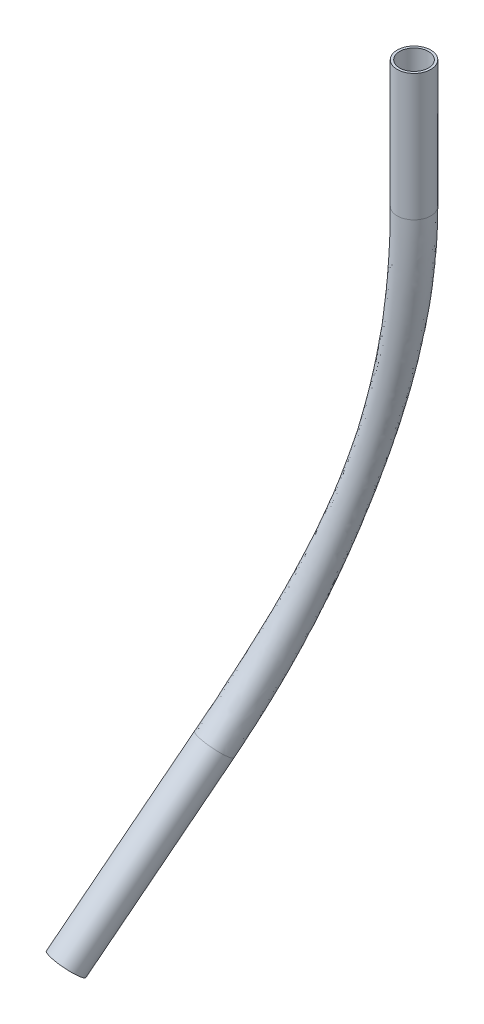
ISO-10303-21;
HEADER;
FILE_DESCRIPTION(('STEP AP214'),'2;1');
FILE_NAME('part.step','',(''),(''),'','','');
FILE_SCHEMA(('AUTOMOTIVE_DESIGN { 1 0 10303 214 1 1 1 1 }'));
ENDSEC;
DATA;
#1=APPLICATION_CONTEXT('core data for automotive mechanical design processes');
#2=APPLICATION_PROTOCOL_DEFINITION('international standard','automotive_design',2000,#1);
#3=PRODUCT_CONTEXT('',#1,'mechanical');
#4=PRODUCT('Part','Part','',(#3));
#5=PRODUCT_RELATED_PRODUCT_CATEGORY('part','',(#4));
#6=PRODUCT_DEFINITION_FORMATION('','',#4);
#7=PRODUCT_DEFINITION_CONTEXT('part definition',#1,'design');
#8=PRODUCT_DEFINITION('design','',#6,#7);
#9=PRODUCT_DEFINITION_SHAPE('','',#8);
#10=(LENGTH_UNIT() NAMED_UNIT(*) SI_UNIT(.MILLI.,.METRE.));
#11=(NAMED_UNIT(*) PLANE_ANGLE_UNIT() SI_UNIT($,.RADIAN.));
#12=(NAMED_UNIT(*) SI_UNIT($,.STERADIAN.) SOLID_ANGLE_UNIT());
#13=UNCERTAINTY_MEASURE_WITH_UNIT(LENGTH_MEASURE(1.E-05),#10,'distance_accuracy_value','');
#14=(GEOMETRIC_REPRESENTATION_CONTEXT(3) GLOBAL_UNCERTAINTY_ASSIGNED_CONTEXT((#13)) GLOBAL_UNIT_ASSIGNED_CONTEXT((#10,
#11,#12)) REPRESENTATION_CONTEXT('',''));
#15=CARTESIAN_POINT('',(0.,0.,0.));
#16=DIRECTION('',(0.,0.,1.));
#17=DIRECTION('',(1.,0.,0.));
#18=AXIS2_PLACEMENT_3D('',#15,#16,#17);
#19=CARTESIAN_POINT('',(-25.0499398331026,28.6977068396148,-25.9548102071857));
#20=DIRECTION('',(0.154747082057597,0.766044443118977,-0.623882402189063));
#21=DIRECTION('',(0.,-0.63148924671694,-0.775384634411124));
#22=AXIS2_PLACEMENT_3D('',#19,#20,#21);
#23=CYLINDRICAL_SURFACE('',#22,0.53213);
#24=CARTESIAN_POINT('',(-24.8170314040896,29.8506733797826,-26.8938099495436));
#25=DIRECTION('',(-0.154747082057597,-0.766044443118977,0.623882402189063));
#26=DIRECTION('',(0.,-0.63148924671694,-0.775384634411123));
#27=AXIS2_PLACEMENT_3D('',#24,#25,#26);
#28=CIRCLE('',#27,0.53213);
#29=CARTESIAN_POINT('',(-24.8170314040896,29.5146390069271,-27.3064153750528));
#30=VERTEX_POINT('',#29);
#31=EDGE_CURVE('E42',#30,#30,#28,.F.);
#32=ORIENTED_EDGE('',*,*,#31,.T.);
#33=EDGE_LOOP('',(#32));
#34=FACE_BOUND('',#33,.T.);
#35=CARTESIAN_POINT('',(-23.3734194889443,34.4514862154564,-30.5037501466175));
#36=CARTESIAN_POINT('',(-23.3716185247215,34.4456207717933,-30.5105054206104));
#37=CARTESIAN_POINT('',(-23.3700411802738,34.4397532343263,-30.5173187319104));
#38=CARTESIAN_POINT('',(-23.3673547745922,34.4280910185778,-30.530972045577));
#39=CARTESIAN_POINT('',(-23.3662409633807,34.4222962229716,-30.5378110138236));
#40=CARTESIAN_POINT('',(-23.3644728982267,34.4107868465445,-30.5515044453138));
#41=CARTESIAN_POINT('',(-23.3638144257776,34.4050720235419,-30.5583581595705));
#42=CARTESIAN_POINT('',(-23.3629477615519,34.3937300001551,-30.5720696862928));
#43=CARTESIAN_POINT('',(-23.3627358632804,34.3881024664429,-30.5789269886857));
#44=CARTESIAN_POINT('',(-23.3627532504102,34.3769423712058,-30.5926344109798));
#45=CARTESIAN_POINT('',(-23.3629793091582,34.3714094157779,-30.5994842142059));
#46=CARTESIAN_POINT('',(-23.3638635073627,34.3604458032342,-30.6131653847723));
#47=CARTESIAN_POINT('',(-23.3645188656099,34.3550147175604,-30.6199965884767));
#48=CARTESIAN_POINT('',(-23.3662526076751,34.3442621438102,-30.6336293514243));
#49=CARTESIAN_POINT('',(-23.3673286187526,34.338940214213,-30.6404308642642));
#50=CARTESIAN_POINT('',(-23.3698946475267,34.3284132315997,-30.6539930708104));
#51=CARTESIAN_POINT('',(-23.3713826634028,34.323207741778,-30.6607538043264));
#52=CARTESIAN_POINT('',(-23.3747637227446,34.3129209009006,-30.6742233080811));
#53=CARTESIAN_POINT('',(-23.3766550983899,34.3078391318664,-30.6809321778575));
#54=CARTESIAN_POINT('',(-23.3808339361621,34.2978069816754,-30.6942868354479));
#55=CARTESIAN_POINT('',(-23.3831200292751,34.2928562124373,-30.7009327602056));
#56=CARTESIAN_POINT('',(-23.3880793969736,34.2830933008412,-30.7141504304398));
#57=CARTESIAN_POINT('',(-23.3907515687034,34.2782808089134,-30.7207223315904));
#58=CARTESIAN_POINT('',(-23.3964742218288,34.2688016832298,-30.733780874995));
#59=CARTESIAN_POINT('',(-23.3995238370125,34.2641347451832,-30.7402676760232));
#60=CARTESIAN_POINT('',(-23.405992535107,34.2549539525993,-30.7531449542875));
#61=CARTESIAN_POINT('',(-23.4094109624411,34.2504398445776,-30.7595355801601));
#62=CARTESIAN_POINT('',(-23.4166084690968,34.2415719325669,-30.7722094556263));
#63=CARTESIAN_POINT('',(-23.4203870811546,34.2372179307733,-30.7784928321981));
#64=CARTESIAN_POINT('',(-23.4282961639297,34.2286774474802,-30.7909411673687));
#65=CARTESIAN_POINT('',(-23.4324263370742,34.2244908286285,-30.7971062208079));
#66=CARTESIAN_POINT('',(-23.4410297673477,34.2162923232159,-30.809306877882));
#67=CARTESIAN_POINT('',(-23.4455028815486,34.2122803649427,-30.8153425341184));
#68=CARTESIAN_POINT('',(-23.4547834343178,34.2044383879083,-30.8272733745541));
#69=CARTESIAN_POINT('',(-23.4595908728861,34.2006083691471,-30.8331685587535));
#70=CARTESIAN_POINT('',(-23.4695313265127,34.1931374726083,-30.8448074428545));
#71=CARTESIAN_POINT('',(-23.4746644757611,34.1894966739263,-30.8505510789215));
#72=CARTESIAN_POINT('',(-23.485247611667,34.1824114118769,-30.8618758654464));
#73=CARTESIAN_POINT('',(-23.4906978604992,34.1789671157724,-30.8674568755572));
#74=CARTESIAN_POINT('',(-23.5019064628108,34.1722820443128,-30.878445421349));
#75=CARTESIAN_POINT('',(-23.5076652022398,34.1690415354722,-30.8838527255163));
#76=CARTESIAN_POINT('',(-23.5194820573782,34.1627712130116,-30.8944828851521));
#77=CARTESIAN_POINT('',(-23.5255406799722,34.1597417785194,-30.8997054008295));
#78=CARTESIAN_POINT('',(-23.5379485761823,34.1539007659479,-30.9099550262927));
#79=CARTESIAN_POINT('',(-23.5442984754354,34.1510896954429,-30.9149816680273));
#80=CARTESIAN_POINT('',(-23.5572802022517,34.145692556268,-30.9248286084075));
#81=CARTESIAN_POINT('',(-23.5639127718781,34.143107142034,-30.9296482875533));
#82=CARTESIAN_POINT('',(-23.5774511195216,34.1381684424741,-30.9390703887815));
#83=CARTESIAN_POINT('',(-23.5843577526753,34.1358159794506,-30.9436720132929));
#84=CARTESIAN_POINT('',(-23.5984355113861,34.1313502884765,-30.952647117925));
#85=CARTESIAN_POINT('',(-23.6056075998201,34.1292380741745,-30.9570195922513));
#86=CARTESIAN_POINT('',(-23.6202075591158,34.1252599634878,-30.9655255393115));
#87=CARTESIAN_POINT('',(-23.6276364922777,34.1233952977945,-30.9696577644122));
#88=CARTESIAN_POINT('',(-23.6427414402014,34.1199193417303,-30.9776723893251));
#89=CARTESIAN_POINT('',(-23.6504186043644,34.1183095265885,-30.9815532628488));
#90=CARTESIAN_POINT('',(-23.6660113265474,34.1153503019358,-30.9890543974278));
#91=CARTESIAN_POINT('',(-23.6739281037479,34.1140026408894,-30.9926728140059));
#92=CARTESIAN_POINT('',(-23.6899913830416,34.1115747266122,-30.9996382867042));
#93=CARTESIAN_POINT('',(-23.6981391508745,34.1104965242061,-31.0029831386376));
#94=CARTESIAN_POINT('',(-23.7146557648421,34.108614501091,-31.0093907743588));
#95=CARTESIAN_POINT('',(-23.7230258933882,34.1078130621702,-31.0124509517161));
#96=CARTESIAN_POINT('',(-23.7399786200603,34.1064915122981,-31.0182785738905));
#97=CARTESIAN_POINT('',(-23.7485624803014,34.1059741410806,-31.0210429677333));
#98=CARTESIAN_POINT('',(-23.7659340730657,34.1052276475272,-31.0262683924576));
#99=CARTESIAN_POINT('',(-23.7747230027509,34.1050016470289,-31.0287258870811));
#100=CARTESIAN_POINT('',(-23.7923917487726,34.104845714864,-31.0332998866824));
#101=CARTESIAN_POINT('',(-23.8012715651091,34.1049157831974,-31.0354163916602));
#102=CARTESIAN_POINT('',(-23.8190063628096,34.1053524519644,-31.0392791396784));
#103=CARTESIAN_POINT('',(-23.8278606233734,34.105715926356,-31.0410290422951));
#104=CARTESIAN_POINT('',(-23.8455309239053,34.1067319172723,-31.0441644621175));
#105=CARTESIAN_POINT('',(-23.8543465416364,34.1073816866508,-31.0455532477214));
#106=CARTESIAN_POINT('',(-23.8719262624038,34.1089627990345,-31.0479723063956));
#107=CARTESIAN_POINT('',(-23.8806901825589,34.1098917505478,-31.0490054705375));
#108=CARTESIAN_POINT('',(-23.8981532660847,34.1120237842725,-31.050719140659));
#109=CARTESIAN_POINT('',(-23.9068524326406,34.1132248044607,-31.0514021793185));
#110=CARTESIAN_POINT('',(-23.9241728217753,34.1158935606957,-31.0524214319735));
#111=CARTESIAN_POINT('',(-23.9327941863661,34.1173595362651,-31.0527598428252));
#112=CARTESIAN_POINT('',(-23.9499458303359,34.1205508178991,-31.0530956485698));
#113=CARTESIAN_POINT('',(-23.9584763496261,34.1222746364736,-31.0530949294098));
#114=CARTESIAN_POINT('',(-23.9754332017538,34.1259742485099,-31.05275825722));
#115=CARTESIAN_POINT('',(-23.9838598376021,34.1279487992311,-31.0524239052687));
#116=CARTESIAN_POINT('',(-24.0005958551116,34.132142549071,-31.0514257221438));
#117=CARTESIAN_POINT('',(-24.0089055737925,34.1343607230691,-31.0507632332756));
#118=CARTESIAN_POINT('',(-24.0253947169873,34.1390344207073,-31.049114503794));
#119=CARTESIAN_POINT('',(-24.0335744885231,34.1414891114353,-31.0481293719605));
#120=CARTESIAN_POINT('',(-24.0497907200965,34.1466285695697,-31.0458410579746));
#121=CARTESIAN_POINT('',(-24.057827517478,34.1493126730138,-31.0445387747536));
#122=CARTESIAN_POINT('',(-24.0737448017902,34.1549037070801,-31.0416218351672));
#123=CARTESIAN_POINT('',(-24.0816256001909,34.1578101218578,-31.0400078894468));
#124=CARTESIAN_POINT('',(-24.097217902579,34.1638385500003,-31.0364732800806));
#125=CARTESIAN_POINT('',(-24.1049296785731,34.1669601773635,-31.0345531578616));
#126=CARTESIAN_POINT('',(-24.1201709646944,34.1734118203524,-31.0304118313912));
#127=CARTESIAN_POINT('',(-24.1277006954993,34.1767415641099,-31.0281910156945));
#128=CARTESIAN_POINT('',(-24.1425649307157,34.1836022452149,-31.0234539216534));
#129=CARTESIAN_POINT('',(-24.1498995934705,34.1871330115882,-31.020937892518));
#130=CARTESIAN_POINT('',(-24.1643607422758,34.1943885564157,-31.015615977355));
#131=CARTESIAN_POINT('',(-24.1714873133612,34.1981132538395,-31.0128102119141));
#132=CARTESIAN_POINT('',(-24.1855193388488,34.2057494901387,-31.0069144190998));
#133=CARTESIAN_POINT('',(-24.192424793251,34.2096610290141,-31.0038243917264));
#134=CARTESIAN_POINT('',(-24.2060016566199,34.2176637864546,-30.9973656619035));
#135=CARTESIAN_POINT('',(-24.21267296734,34.2217550788602,-30.9939968444184));
#136=CARTESIAN_POINT('',(-24.2257686274344,34.2301101887815,-30.9869861155947));
#137=CARTESIAN_POINT('',(-24.2321927649443,34.2343741481451,-30.9833439775351));
#138=CARTESIAN_POINT('',(-24.244781177827,34.2430674432778,-30.9757921853209));
#139=CARTESIAN_POINT('',(-24.2509451095765,34.247496984008,-30.9718821942694));
#140=CARTESIAN_POINT('',(-24.2630002281341,34.2565142981635,-30.9638002721598));
#141=CARTESIAN_POINT('',(-24.2688909181162,34.2611023352435,-30.9596278941367));
#142=CARTESIAN_POINT('',(-24.2803866917007,34.2704295029698,-30.9510267738458));
#143=CARTESIAN_POINT('',(-24.2859911000884,34.2751689515104,-30.9465974737667));
#144=CARTESIAN_POINT('',(-24.2969014742017,34.2847918077122,-30.9374880856158));
#145=CARTESIAN_POINT('',(-24.302206557072,34.2896755824676,-30.9328073278185));
#146=CARTESIAN_POINT('',(-24.3125054731054,34.299579961989,-30.9232006011833));
#147=CARTESIAN_POINT('',(-24.3174981822739,34.3046009768379,-30.9182738500237));
#148=CARTESIAN_POINT('',(-24.327159577316,34.3147727140128,-30.9081807138394));
#149=CARTESIAN_POINT('',(-24.3318268603091,34.3199238814171,-30.9030134343488));
#150=CARTESIAN_POINT('',(-24.3408246670394,34.330348809582,-30.8924448176815));
#151=CARTESIAN_POINT('',(-24.3451534672276,34.3356230400255,-30.8870424762896));
#152=CARTESIAN_POINT('',(-24.353461613925,34.3462869910402,-30.8760093089273));
#153=CARTESIAN_POINT('',(-24.35743887086,34.3516771925138,-30.8703773741771));
#154=CARTESIAN_POINT('',(-24.3650312815062,34.3625659961742,-30.8588905873759));
#155=CARTESIAN_POINT('',(-24.3686439314298,34.3680650735588,-30.8530345308086));
#156=CARTESIAN_POINT('',(-24.3754945260756,34.3791645574068,-30.8411050576173));
#157=CARTESIAN_POINT('',(-24.3787295028193,34.3847654124514,-30.8350303540213));
#158=CARTESIAN_POINT('',(-24.3848121976592,34.3960614001804,-30.8226691312577));
#159=CARTESIAN_POINT('',(-24.3876564331578,34.401756929601,-30.8163812611312));
#160=CARTESIAN_POINT('',(-24.39294514245,34.4132352449676,-30.8035992250548));
#161=CARTESIAN_POINT('',(-24.3953855697898,34.4190183461957,-30.7971036683029));
#162=CARTESIAN_POINT('',(-24.3998542015541,34.430664796448,-30.7839117738968));
#163=CARTESIAN_POINT('',(-24.4018777493882,34.4365283451348,-30.7772140360681));
#164=CARTESIAN_POINT('',(-24.4054789196991,34.4482593779381,-30.7637031214088));
#165=CARTESIAN_POINT('',(-24.4070565421761,34.4541268620546,-30.7568899445782));
#166=CARTESIAN_POINT('',(-24.4097431488713,34.4657890392309,-30.7432367281324));
#167=CARTESIAN_POINT('',(-24.4108568867702,34.4715838489049,-30.7363977244281));
#168=CARTESIAN_POINT('',(-24.4126248988486,34.4830932355166,-30.7227042672677));
#169=CARTESIAN_POINT('',(-24.4132833906624,34.4888080548033,-30.7158505623767));
#170=CARTESIAN_POINT('',(-24.4141500689252,34.5001500754966,-30.7021390424435));
#171=CARTESIAN_POINT('',(-24.4143619620734,34.5057776101918,-30.6952817375727));
#172=CARTESIAN_POINT('',(-24.4143445712256,34.5169377061424,-30.6815743134804));
#173=CARTESIAN_POINT('',(-24.414118513835,34.5224706613099,-30.6747245109108));
#174=CARTESIAN_POINT('',(-24.4132343166168,34.5334342736643,-30.6610433408215));
#175=CARTESIAN_POINT('',(-24.4125789580094,34.5388653594072,-30.6542121369428));
#176=CARTESIAN_POINT('',(-24.4108452156822,34.5496179332077,-30.6405793738685));
#177=CARTESIAN_POINT('',(-24.4097692047005,34.5549398627865,-30.6337778610749));
#178=CARTESIAN_POINT('',(-24.4072031759959,34.5654668453865,-30.6202156545624));
#179=CARTESIAN_POINT('',(-24.4057151600944,34.570672335213,-30.6134549210341));
#180=CARTESIAN_POINT('',(-24.4023341007341,34.580959176094,-30.5999854172704));
#181=CARTESIAN_POINT('',(-24.4004427250955,34.5860409451269,-30.5932765474973));
#182=CARTESIAN_POINT('',(-24.3962638873283,34.5960730953169,-30.5799218899092));
#183=CARTESIAN_POINT('',(-24.3939777942135,34.6010238645554,-30.5732759651507));
#184=CARTESIAN_POINT('',(-24.3890184265136,34.6107867761517,-30.5600582949159));
#185=CARTESIAN_POINT('',(-24.3863462547844,34.6155992680795,-30.5534863937655));
#186=CARTESIAN_POINT('',(-24.3806236016594,34.625078393763,-30.5404278503611));
#187=CARTESIAN_POINT('',(-24.3775739864755,34.6297453318096,-30.5339410493328));
#188=CARTESIAN_POINT('',(-24.3711052883809,34.6389261243935,-30.5210637710685));
#189=CARTESIAN_POINT('',(-24.3676868610468,34.6434402324153,-30.5146731451959));
#190=CARTESIAN_POINT('',(-24.3604893543911,34.6523081444259,-30.5019992697297));
#191=CARTESIAN_POINT('',(-24.3567107423333,34.6566621462195,-30.4957158931579));
#192=CARTESIAN_POINT('',(-24.3488016595582,34.6652026295127,-30.4832675579873));
#193=CARTESIAN_POINT('',(-24.3446714864137,34.6693892483643,-30.4771025045481));
#194=CARTESIAN_POINT('',(-24.3360680561402,34.6775877537769,-30.4649018474739));
#195=CARTESIAN_POINT('',(-24.3315949419394,34.6815997120502,-30.4588661912376));
#196=CARTESIAN_POINT('',(-24.3223143891702,34.6894416890845,-30.4469353508019));
#197=CARTESIAN_POINT('',(-24.3175069506018,34.6932717078457,-30.4410401666025));
#198=CARTESIAN_POINT('',(-24.3075664969753,34.7007426043845,-30.4294012825015));
#199=CARTESIAN_POINT('',(-24.3024333477268,34.7043834030665,-30.4236576464344));
#200=CARTESIAN_POINT('',(-24.291850211821,34.7114686651159,-30.4123328599095));
#201=CARTESIAN_POINT('',(-24.2863999629888,34.7149129612204,-30.4067518497987));
#202=CARTESIAN_POINT('',(-24.2751913606771,34.72159803268,-30.395763304007));
#203=CARTESIAN_POINT('',(-24.2694326212482,34.7248385415207,-30.3903559998397));
#204=CARTESIAN_POINT('',(-24.2576157661098,34.7311088639812,-30.3797258402039));
#205=CARTESIAN_POINT('',(-24.2515571435157,34.7341382984735,-30.3745033245265));
#206=CARTESIAN_POINT('',(-24.2391492473056,34.739979311045,-30.3642536990632));
#207=CARTESIAN_POINT('',(-24.2327993480525,34.7427903815499,-30.3592270573287));
#208=CARTESIAN_POINT('',(-24.2198176212363,34.7481875207249,-30.3493801169485));
#209=CARTESIAN_POINT('',(-24.2131850516099,34.7507729349588,-30.3445604378026));
#210=CARTESIAN_POINT('',(-24.1996467039664,34.7557116345188,-30.3351383365745));
#211=CARTESIAN_POINT('',(-24.1927400708126,34.7580640975422,-30.3305367120631));
#212=CARTESIAN_POINT('',(-24.1786623121019,34.7625297885163,-30.321561607431));
#213=CARTESIAN_POINT('',(-24.1714902236678,34.7646420028184,-30.3171891331047));
#214=CARTESIAN_POINT('',(-24.1568902643722,34.7686201135051,-30.3086831860445));
#215=CARTESIAN_POINT('',(-24.1494613312102,34.7704847791984,-30.3045509609438));
#216=CARTESIAN_POINT('',(-24.1343563832865,34.7739607352625,-30.2965363360309));
#217=CARTESIAN_POINT('',(-24.1266792191235,34.7755705504043,-30.2926554625072));
#218=CARTESIAN_POINT('',(-24.1110864969405,34.778529775057,-30.2851543279282));
#219=CARTESIAN_POINT('',(-24.1031697197401,34.7798774361034,-30.2815359113501));
#220=CARTESIAN_POINT('',(-24.0871064404464,34.7823053503806,-30.2745704386518));
#221=CARTESIAN_POINT('',(-24.0789586726135,34.7833835527867,-30.2712255867184));
#222=CARTESIAN_POINT('',(-24.0624420586458,34.7852655759018,-30.2648179509972));
#223=CARTESIAN_POINT('',(-24.0540719300997,34.7860670148227,-30.2617577736399));
#224=CARTESIAN_POINT('',(-24.0371192034276,34.7873885646948,-30.2559301514654));
#225=CARTESIAN_POINT('',(-24.0285353431865,34.7879059359122,-30.2531657576227));
#226=CARTESIAN_POINT('',(-24.0111637504222,34.7886524294657,-30.2479403328984));
#227=CARTESIAN_POINT('',(-24.002374820737,34.788878429964,-30.2454828382749));
#228=CARTESIAN_POINT('',(-23.9847060747153,34.7890343621288,-30.2409088386736));
#229=CARTESIAN_POINT('',(-23.9758262583788,34.7889642937954,-30.2387923336958));
#230=CARTESIAN_POINT('',(-23.9580914606783,34.7885276250285,-30.2349295856776));
#231=CARTESIAN_POINT('',(-23.9492372001145,34.7881641506368,-30.2331796830609));
#232=CARTESIAN_POINT('',(-23.9315668995826,34.7871481597205,-30.2300442632384));
#233=CARTESIAN_POINT('',(-23.9227512818515,34.786498390342,-30.2286554776345));
#234=CARTESIAN_POINT('',(-23.9051715610841,34.7849172779583,-30.2262364189604));
#235=CARTESIAN_POINT('',(-23.896407640929,34.7839883264451,-30.2252032548184));
#236=CARTESIAN_POINT('',(-23.8789445574033,34.7818562927203,-30.223489584697));
#237=CARTESIAN_POINT('',(-23.8702453908473,34.7806552725321,-30.2228065460375));
#238=CARTESIAN_POINT('',(-23.8529250017127,34.7779865162971,-30.2217872933825));
#239=CARTESIAN_POINT('',(-23.8443036371218,34.7765205407277,-30.2214488825308));
#240=CARTESIAN_POINT('',(-23.827151993152,34.7733292590937,-30.2211130767861));
#241=CARTESIAN_POINT('',(-23.8186214738618,34.7716054405193,-30.2211137959462));
#242=CARTESIAN_POINT('',(-23.8016646217342,34.7679058284829,-30.221450468136));
#243=CARTESIAN_POINT('',(-23.7932379858859,34.7659312777617,-30.2217848200873));
#244=CARTESIAN_POINT('',(-23.7765019683763,34.7617375279219,-30.2227830032122));
#245=CARTESIAN_POINT('',(-23.7681922496954,34.7595193539237,-30.2234454920804));
#246=CARTESIAN_POINT('',(-23.7517031065007,34.7548456562856,-30.225094221562));
#247=CARTESIAN_POINT('',(-23.7435233349648,34.7523909655575,-30.2260793533955));
#248=CARTESIAN_POINT('',(-23.7273071033914,34.7472515074231,-30.2283676673814));
#249=CARTESIAN_POINT('',(-23.71927030601,34.744567403979,-30.2296699506024));
#250=CARTESIAN_POINT('',(-23.7033530216978,34.7389763699127,-30.2325868901888));
#251=CARTESIAN_POINT('',(-23.6954722232971,34.736069955135,-30.2342008359092));
#252=CARTESIAN_POINT('',(-23.6798799209089,34.7300415269925,-30.2377354452754));
#253=CARTESIAN_POINT('',(-23.6721681449148,34.7269198996293,-30.2396555674944));
#254=CARTESIAN_POINT('',(-23.6569268587936,34.7204682566404,-30.2437968939647));
#255=CARTESIAN_POINT('',(-23.6493971279886,34.7171385128829,-30.2460177096615));
#256=CARTESIAN_POINT('',(-23.6345328927723,34.710277831778,-30.2507548037025));
#257=CARTESIAN_POINT('',(-23.6271982300174,34.7067470654046,-30.253270832838));
#258=CARTESIAN_POINT('',(-23.6127370812122,34.6994915205772,-30.258592748001));
#259=CARTESIAN_POINT('',(-23.6056105101268,34.6957668231534,-30.2613985134419));
#260=CARTESIAN_POINT('',(-23.5915784846391,34.6881305868541,-30.2672943062562));
#261=CARTESIAN_POINT('',(-23.5846730302369,34.6842190479787,-30.2703843336295));
#262=CARTESIAN_POINT('',(-23.5710961668681,34.6762162905383,-30.2768430634525));
#263=CARTESIAN_POINT('',(-23.564424856148,34.6721249981326,-30.2802118809376));
#264=CARTESIAN_POINT('',(-23.5513291960535,34.6637698882113,-30.2872226097613));
#265=CARTESIAN_POINT('',(-23.5449050585437,34.6595059288478,-30.2908647478209));
#266=CARTESIAN_POINT('',(-23.5323166456609,34.6508126337151,-30.2984165400351));
#267=CARTESIAN_POINT('',(-23.5261527139114,34.6463830929848,-30.3023265310866));
#268=CARTESIAN_POINT('',(-23.5140975953539,34.6373657788293,-30.3104084531962));
#269=CARTESIAN_POINT('',(-23.5082069053719,34.6327777417494,-30.3145808312193));
#270=CARTESIAN_POINT('',(-23.4967111317871,34.623450574023,-30.3231819515102));
#271=CARTESIAN_POINT('',(-23.4911067233989,34.6187111254823,-30.3276112515892));
#272=CARTESIAN_POINT('',(-23.4801963492869,34.6090882692808,-30.3367206397402));
#273=CARTESIAN_POINT('',(-23.4748912664187,34.6042044945256,-30.3414013975376));
#274=CARTESIAN_POINT('',(-23.4645923503798,34.5943001150034,-30.3510081241725));
#275=CARTESIAN_POINT('',(-23.4595996412038,34.5892791001533,-30.3559348753317));
#276=CARTESIAN_POINT('',(-23.4499382461822,34.5791073629817,-30.3660280115172));
#277=CARTESIAN_POINT('',(-23.4452709632175,34.5739561955818,-30.3711952910093));
#278=CARTESIAN_POINT('',(-23.4362731564097,34.5635312674048,-30.3817639076723));
#279=CARTESIAN_POINT('',(-23.4319443561151,34.5582570369447,-30.3871662490582));
#280=CARTESIAN_POINT('',(-23.423636209709,34.5475930859754,-30.398199416437));
#281=CARTESIAN_POINT('',(-23.4196589531746,34.5422028845642,-30.4038313512099));
#282=CARTESIAN_POINT('',(-23.4120665414316,34.5313140807329,-30.4153181379488));
#283=CARTESIAN_POINT('',(-23.4084538899984,34.5258150031132,-30.4211741944304));
#284=CARTESIAN_POINT('',(-23.4016032994874,34.5147155199093,-30.4331036678564));
#285=CARTESIAN_POINT('',(-23.3983683284412,34.5091146657522,-30.4391783717758));
#286=CARTESIAN_POINT('',(-23.3922856179909,34.4978186755914,-30.4515395936535));
#287=CARTESIAN_POINT('',(-23.389441360957,34.4921231428159,-30.4578274625578));
#288=CARTESIAN_POINT('',(-23.3841527106896,34.4806448366445,-30.470609501984));
#289=CARTESIAN_POINT('',(-23.38171236488,34.4748617481177,-30.4771050633631));
#290=CARTESIAN_POINT('',(-23.3772435095704,34.4632152630402,-30.4902969450821));
#291=CARTESIAN_POINT('',(-23.3752196525431,34.4573516661852,-30.4969946653629));
#292=CARTESIAN_POINT('',(-23.3734194889443,34.4514862154564,-30.5037501466175));
#293=B_SPLINE_CURVE_WITH_KNOTS('',3,(#35,#36,#37,#38,#39,#40,#41,#42,#43,#44,#45,#46,#47,#48,
#49,#50,#51,#52,#53,#54,#55,#56,#57,#58,#59,#60,#61,#62,#63,#64,#65,#66,#67,#68,#69,#70,#71,#72,
#73,#74,#75,#76,#77,#78,#79,#80,#81,#82,#83,#84,#85,#86,#87,#88,#89,#90,#91,#92,#93,#94,#95,#96,
#97,#98,#99,#100,#101,#102,#103,#104,#105,#106,#107,#108,#109,#110,#111,#112,#113,#114,#115,
#116,#117,#118,#119,#120,#121,#122,#123,#124,#125,#126,#127,#128,#129,#130,#131,#132,#133,#134,
#135,#136,#137,#138,#139,#140,#141,#142,#143,#144,#145,#146,#147,#148,#149,#150,#151,#152,#153,
#154,#155,#156,#157,#158,#159,#160,#161,#162,#163,#164,#165,#166,#167,#168,#169,#170,#171,#172,
#173,#174,#175,#176,#177,#178,#179,#180,#181,#182,#183,#184,#185,#186,#187,#188,#189,#190,#191,
#192,#193,#194,#195,#196,#197,#198,#199,#200,#201,#202,#203,#204,#205,#206,#207,#208,#209,#210,
#211,#212,#213,#214,#215,#216,#217,#218,#219,#220,#221,#222,#223,#224,#225,#226,#227,#228,#229,
#230,#231,#232,#233,#234,#235,#236,#237,#238,#239,#240,#241,#242,#243,#244,#245,#246,#247,#248,
#249,#250,#251,#252,#253,#254,#255,#256,#257,#258,#259,#260,#261,#262,#263,#264,#265,#266,#267,
#268,#269,#270,#271,#272,#273,#274,#275,#276,#277,#278,#279,#280,#281,#282,#283,#284,#285,#286,
#287,#288,#289,#290,#291,#292),.UNSPECIFIED.,.F.,.F.,(4,2,2,2,2,2,2,2,2,2,2,2,2,2,2,2,2,2,2,2,2,
2,2,2,2,2,2,2,2,2,2,2,2,2,2,2,2,2,2,2,2,2,2,2,2,2,2,2,2,2,2,2,2,2,2,2,2,2,2,2,2,2,2,2,2,2,2,2,2,
2,2,2,2,2,2,2,2,2,2,2,2,2,2,2,2,2,2,2,2,2,2,2,2,2,2,2,2,2,2,2,2,2,2,2,2,2,2,2,2,2,2,2,2,2,2,2,2,
2,2,2,2,2,2,2,2,2,2,2,4),(0.,0.0273748009484272,0.0544617320112196,0.0812942259599497,
0.107903122935457,0.134316723902233,0.160560875015818,0.186659080652079,0.212632642421721,
0.238500821242431,0.26428101944725,0.289988979944409,0.315638999578798,0.341244154045959,
0.366816531943377,0.392367475782587,0.417907828005344,0.443448180228105,0.468999124067313,
0.49457150196473,0.520176656431897,0.545826676066282,0.571534636563437,0.597314834768267,
0.62318301358897,0.649156575358613,0.675254780994877,0.701498932108455,0.727912533075239,
0.754521430050749,0.781353923999469,0.808440855062266,0.835815656010695,0.863190456959124,
0.890277388021923,0.917109881970651,0.943718778946161,0.970132379912937,0.996376531026517,
1.02247473666278,1.04844829843243,1.07431647725313,1.10009667545795,1.12580463595511,
1.1514546555895,1.17705981005666,1.20263218795408,1.22818313179329,1.25372348401605,
1.27926383623881,1.30481478007801,1.33038715797543,1.3559923124426,1.38164233207698,
1.40735029257414,1.43313049077896,1.45899866959967,1.48497223136931,1.51107043700557,
1.53731458811915,1.56372818908593,1.59033708606144,1.61716958001017,1.64425651107298,
1.6716313120214,1.69900611296982,1.72609304403262,1.75292553798134,1.77953443495685,
1.80594803592363,1.83219218703722,1.85829039267348,1.88426395444312,1.91013213326383,
1.93591233146865,1.9616202919658,1.98727031160019,2.01287546606735,2.03844784396478,
2.06399878780398,2.08953914002674,2.1150794922495,2.14063043608871,2.16620281398613,
2.19180796845329,2.21745798808768,2.24316594858484,2.26894614678966,2.29481432561036,
2.32078788738001,2.34688609301626,2.37313024412986,2.39954384509663,2.42615274207214,
2.45298523602087,2.48007216708367,2.50744696803209,2.53482176898052,2.56190870004332,
2.58874119399205,2.61535009096756,2.64176369193434,2.66800784304792,2.69410604868418,
2.72007961045383,2.74594778927453,2.77172798747935,2.79743594797651,2.82308596761089,
2.84869112207806,2.87426349997548,2.89981444381469,2.92535479603745,2.95089514826021,
2.97644609209941,3.00201846999683,3.027623624464,3.05327364409838,3.07898160459554,
3.10476180280036,3.13062998162106,3.15660354339071,3.18270174902697,3.20894590014055,
3.23535950110734,3.26196839808284,3.28880089203157,3.31588782309437,3.3432626240428),.UNSPECIFIED.);
#294=CARTESIAN_POINT('',(-23.3734194889443,34.4514862154564,-30.5037501466175));
#295=VERTEX_POINT('',#294);
#296=EDGE_CURVE('E47',#295,#295,#293,.F.);
#297=ORIENTED_EDGE('',*,*,#296,.T.);
#298=EDGE_LOOP('',(#297));
#299=FACE_BOUND('',#298,.T.);
#300=ADVANCED_FACE('F33',(#34,#299),#23,.T.);
#301=CARTESIAN_POINT('',(-25.0499398331026,28.6977068396148,-25.9548102071857));
#302=DIRECTION('',(0.154747082057597,0.766044443118977,-0.623882402189063));
#303=DIRECTION('',(0.,-0.63148924671694,-0.775384634411124));
#304=AXIS2_PLACEMENT_3D('',#301,#302,#303);
#305=CYLINDRICAL_SURFACE('',#304,0.455929999999999);
#306=CARTESIAN_POINT('',(-24.8170314040896,29.8506733797826,-26.8938099495436));
#307=DIRECTION('',(-0.154747082057597,-0.766044443118977,0.623882402189063));
#308=DIRECTION('',(0.,-0.63148924671694,-0.775384634411123));
#309=AXIS2_PLACEMENT_3D('',#306,#307,#308);
#310=CIRCLE('',#309,0.455929999999999);
#311=CARTESIAN_POINT('',(-24.8170314040896,29.5627584875269,-27.2473310659107));
#312=VERTEX_POINT('',#311);
#313=EDGE_CURVE('E10',#312,#312,#310,.F.);
#314=ORIENTED_EDGE('',*,*,#313,.F.);
#315=EDGE_LOOP('',(#314));
#316=FACE_BOUND('',#315,.T.);
#317=CARTESIAN_POINT('',(-23.888548911744,34.4469400384964,-30.637104362678));
#318=DIRECTION('',(-0.154747082057597,-0.766044443118977,0.623882402189063));
#319=DIRECTION('',(0.,-0.63148924671694,-0.775384634411123));
#320=AXIS2_PLACEMENT_3D('',#317,#318,#319);
#321=CIRCLE('',#320,0.455929999999999);
#322=CARTESIAN_POINT('',(-23.888548911744,34.1590251462408,-30.9906254790451));
#323=VERTEX_POINT('',#322);
#324=EDGE_CURVE('E55',#323,#323,#321,.F.);
#325=ORIENTED_EDGE('',*,*,#324,.T.);
#326=EDGE_LOOP('',(#325));
#327=FACE_BOUND('',#326,.T.);
#328=ADVANCED_FACE('F130',(#316,#327),#305,.F.);
#329=CARTESIAN_POINT('',(-27.9190192923681,28.8222132042841,-28.9260355296372));
#330=DIRECTION('',(0.154747082057597,0.766044443118977,-0.623882402189063));
#331=DIRECTION('',(-0.970588718244434,0.,-0.240743722694126));
#332=AXIS2_PLACEMENT_3D('',#329,#330,#331);
#333=PLANE('',#332);
#334=ORIENTED_EDGE('',*,*,#31,.F.);
#335=EDGE_LOOP('',(#334));
#336=FACE_BOUND('',#335,.T.);
#337=ORIENTED_EDGE('',*,*,#313,.T.);
#338=EDGE_LOOP('',(#337));
#339=FACE_BOUND('',#338,.T.);
#340=ADVANCED_FACE('F135',(#336,#339),#333,.F.);
#341=CARTESIAN_POINT('',(-23.888548911744,34.4469400384964,-30.637104362678));
#342=DIRECTION('',(0.154747082057597,0.766044443118977,-0.623882402189063));
#343=DIRECTION('',(0.,-0.63148924671694,-0.775384634411123));
#344=AXIS2_PLACEMENT_3D('',#341,#342,#343);
#345=PLANE('',#344);
#346=ORIENTED_EDGE('',*,*,#324,.F.);
#347=EDGE_LOOP('',(#346));
#348=FACE_BOUND('',#347,.T.);
#349=ADVANCED_FACE('F84',(#348),#345,.F.);
#350=CARTESIAN_POINT('',(-23.3734194889443,34.4514862154564,-30.5037501466175));
#351=CARTESIAN_POINT('',(-22.5988027976618,38.2860710361463,-33.6267151531768));
#352=CARTESIAN_POINT('',(-20.9316803675583,43.97323295975,-33.4199440515794));
#353=CARTESIAN_POINT('',(-20.9316803675583,48.9789279362416,-33.4199440515794));
#354=CARTESIAN_POINT('',(-23.3763168091754,34.4609244135249,-30.4928799452653));
#355=CARTESIAN_POINT('',(-22.6021501222693,38.2932815776589,-33.6140307023566));
#356=CARTESIAN_POINT('',(-20.9462852616539,43.9761409588563,-33.420724798709));
#357=CARTESIAN_POINT('',(-20.9462852616539,48.9789279362416,-33.420724798709));
#358=CARTESIAN_POINT('',(-23.383211052083,34.4796130664678,-30.4716428103231));
#359=CARTESIAN_POINT('',(-22.6099218070557,38.30762663028,-33.58925604968));
#360=CARTESIAN_POINT('',(-20.9751569058412,43.9818111263783,-33.4234573371905));
#361=CARTESIAN_POINT('',(-20.9751569058412,48.9789279362416,-33.4234573371905));
#362=CARTESIAN_POINT('',(-23.3966911139882,34.5069956844591,-30.4413641840336));
#363=CARTESIAN_POINT('',(-22.6246166415672,38.3289957597304,-33.5540799142314));
#364=CARTESIAN_POINT('',(-21.0173205986927,43.9896611781539,-33.4309253265176));
#365=CARTESIAN_POINT('',(-21.0173205986927,48.9789279362416,-33.4309253265176));
#366=CARTESIAN_POINT('',(-23.4131497636457,34.5336408091872,-30.4127299067044));
#367=CARTESIAN_POINT('',(-22.6421953247092,38.3500963829696,-33.520930080476));
#368=CARTESIAN_POINT('',(-21.0582111766977,43.9968990108133,-33.4416185463873));
#369=CARTESIAN_POINT('',(-21.0582111766977,48.9789279362416,-33.4416185463873));
#370=CARTESIAN_POINT('',(-23.5288125293545,34.6885638069351,-30.251193973512));
#371=CARTESIAN_POINT('',(-22.7639956039969,38.4746368487219,-33.3346499862679));
#372=CARTESIAN_POINT('',(-21.2951399071455,44.0365605895485,-33.5242655424878));
#373=CARTESIAN_POINT('',(-21.2951399071455,48.9789279362416,-33.5242655424878));
#374=CARTESIAN_POINT('',(-23.7660943193292,34.790963678688,-30.18431568369));
#375=CARTESIAN_POINT('',(-23.0020608237968,38.5731585079998,-33.2646132001772));
#376=CARTESIAN_POINT('',(-21.4451243420526,44.0416232363831,-33.7438023576144));
#377=CARTESIAN_POINT('',(-21.4451243420526,48.9789279362416,-33.7438023576144));
#378=CARTESIAN_POINT('',(-24.2778481082223,34.7864472927444,-30.3167960319546));
#379=CARTESIAN_POINT('',(-23.5041817645406,38.6163276079351,-33.4359295921554));
#380=CARTESIAN_POINT('',(-21.417017445388,43.9793742555215,-34.2695785450581));
#381=CARTESIAN_POINT('',(-21.417017445388,48.9789279362416,-34.2695785450581));
#382=CARTESIAN_POINT('',(-24.4616247391671,34.6311578229075,-30.5530545516938));
#383=CARTESIAN_POINT('',(-23.6747652326146,38.5263482490866,-33.7253780139906));
#384=CARTESIAN_POINT('',(-21.1671936583272,43.8941179605702,-34.4940476261576));
#385=CARTESIAN_POINT('',(-21.1671936583272,48.9789279362416,-34.4940476261576));
#386=CARTESIAN_POINT('',(-24.3457319299202,34.2536299001654,-30.9878626057832));
#387=CARTESIAN_POINT('',(-23.5426801899047,38.2289767357646,-34.2254671019797));
#388=CARTESIAN_POINT('',(-20.5829978945008,43.7894811994264,-34.4628177409747));
#389=CARTESIAN_POINT('',(-20.5829978945008,48.9789279362416,-34.4628177409747));
#390=CARTESIAN_POINT('',(-24.067865036258,34.1024145776445,-31.104613080362));
#391=CARTESIAN_POINT('',(-23.2618142256502,38.0926077116755,-34.3543087083623));
#392=CARTESIAN_POINT('',(-20.3585288134013,43.770100733234,-34.2129939539139));
#393=CARTESIAN_POINT('',(-20.3585288134013,48.9789279362416,-34.2129939539139));
#394=CARTESIAN_POINT('',(-23.5561112473649,34.106930963588,-30.9721327320975));
#395=CARTESIAN_POINT('',(-22.7589270293659,38.053231806359,-34.1860815723559));
#396=CARTESIAN_POINT('',(-20.3866357100659,43.8273980501902,-33.6872177664701));
#397=CARTESIAN_POINT('',(-20.3866357100659,48.9789279362416,-33.6872177664701));
#398=CARTESIAN_POINT('',(-23.3828108360381,34.2129543506384,-30.7989649057831));
#399=CARTESIAN_POINT('',(-22.5952025897593,38.1118512629048,-33.9743070068345));
#400=CARTESIAN_POINT('',(-20.5591704255078,43.8892794866138,-33.4849221513972));
#401=CARTESIAN_POINT('',(-20.5591704255078,48.9789279362416,-33.4849221513972));
#402=CARTESIAN_POINT('',(-23.3626320281576,34.3690761924141,-30.6022629623559));
#403=CARTESIAN_POINT('',(-22.5837878969962,38.2245881077208,-33.7422714266123));
#404=CARTESIAN_POINT('',(-20.8035599411116,43.9459145778928,-33.4280054232846));
#405=CARTESIAN_POINT('',(-20.8035599411116,48.9789279362416,-33.4280054232846));
#406=CARTESIAN_POINT('',(-23.3625770570309,34.3958670549685,-30.5693537186658));
#407=CARTESIAN_POINT('',(-22.5851758544462,38.2442360412886,-33.7035448341574));
#408=CARTESIAN_POINT('',(-20.845357491655,43.9552390094591,-33.4217325380364));
#409=CARTESIAN_POINT('',(-20.845357491655,48.9789279362416,-33.4217325380364));
#410=CARTESIAN_POINT('',(-23.3659361434286,34.4233389937084,-30.5364550231377));
#411=CARTESIAN_POINT('',(-22.5899468721433,38.2647184968563,-33.6649537593025));
#412=CARTESIAN_POINT('',(-20.8880770557455,43.9643631317406,-33.4188022303092));
#413=CARTESIAN_POINT('',(-20.8880770557455,48.9789279362416,-33.4188022303092));
#414=CARTESIAN_POINT('',(-23.3705221687131,34.4420480173878,-30.5146203479697));
#415=CARTESIAN_POINT('',(-22.5954554730543,38.2788604946337,-33.639399603997));
#416=CARTESIAN_POINT('',(-20.9170754734626,43.9703249606438,-33.4191633044499));
#417=CARTESIAN_POINT('',(-20.9170754734626,48.9789279362416,-33.4191633044499));
#418=CARTESIAN_POINT('',(-23.3734194889443,34.4514862154564,-30.5037501466175));
#419=CARTESIAN_POINT('',(-22.5988027976618,38.2860710361463,-33.6267151531768));
#420=CARTESIAN_POINT('',(-20.9316803675583,43.97323295975,-33.4199440515794));
#421=CARTESIAN_POINT('',(-20.9316803675583,48.9789279362416,-33.4199440515794));
#422=B_SPLINE_SURFACE_WITH_KNOTS('',3,3,((#350,#351,#352,#353),(#354,#355,#356,#357),(#358,#359,
#360,#361),(#362,#363,#364,#365),(#366,#367,#368,#369),(#370,#371,#372,#373),(#374,#375,#376,
#377),(#378,#379,#380,#381),(#382,#383,#384,#385),(#386,#387,#388,#389),(#390,#391,#392,#393),
(#394,#395,#396,#397),(#398,#399,#400,#401),(#402,#403,#404,#405),(#406,#407,#408,#409),(#410,
#411,#412,#413),(#414,#415,#416,#417),(#418,#419,#420,#421)),.UNSPECIFIED.,.T.,.F.,.F.,(4,1,1,1,
1,2,2,2,1,1,1,1,4),(4,4),(0.,0.0125,0.0249999999999999,0.0375000000000001,0.05,0.25,0.5,0.75,
0.95,0.9625,0.975,0.9875,1.),(0.,1.),.UNSPECIFIED.);
#423=CARTESIAN_POINT('',(-20.9033880719861,48.9789279362416,-33.9491883675728));
#424=DIRECTION('',(0.,-1.,0.));
#425=DIRECTION('',(0.,0.,-1.));
#426=AXIS2_PLACEMENT_3D('',#423,#424,#425);
#427=CIRCLE('',#426,0.529999999999999);
#428=CARTESIAN_POINT('',(-20.9033880719861,48.9789279362416,-34.4791883675728));
#429=VERTEX_POINT('',#428);
#430=EDGE_CURVE('E57',#429,#429,#427,.T.);
#431=ORIENTED_EDGE('',*,*,#296,.F.);
#432=EDGE_LOOP('',(#431));
#433=FACE_BOUND('',#432,.T.);
#434=ORIENTED_EDGE('',*,*,#430,.T.);
#435=EDGE_LOOP('',(#434));
#436=FACE_BOUND('',#435,.T.);
#437=ADVANCED_FACE('F71',(#433,#436),#422,.F.);
#438=CARTESIAN_POINT('',(-20.9033880719861,48.9789279362416,-33.9491883675728));
#439=DIRECTION('',(0.,1.,0.));
#440=DIRECTION('',(0.,0.,-1.));
#441=AXIS2_PLACEMENT_3D('',#438,#439,#440);
#442=CYLINDRICAL_SURFACE('',#441,0.529999999999999);
#443=ORIENTED_EDGE('',*,*,#430,.F.);
#444=EDGE_LOOP('',(#443));
#445=FACE_BOUND('',#444,.T.);
#446=CARTESIAN_POINT('',(-20.9033880719861,52.9789279362436,-33.9491883675728));
#447=DIRECTION('',(0.,-1.,0.));
#448=DIRECTION('',(0.,0.,-1.));
#449=AXIS2_PLACEMENT_3D('',#446,#447,#448);
#450=CIRCLE('',#449,0.529999999999999);
#451=CARTESIAN_POINT('',(-20.9033880719861,52.9789279362436,-34.4791883675728));
#452=VERTEX_POINT('',#451);
#453=EDGE_CURVE('E61',#452,#452,#450,.T.);
#454=ORIENTED_EDGE('',*,*,#453,.T.);
#455=EDGE_LOOP('',(#454));
#456=FACE_BOUND('',#455,.T.);
#457=ADVANCED_FACE('F83',(#445,#456),#442,.T.);
#458=CARTESIAN_POINT('',(-20.9033880719861,52.9789279362436,-33.9491883675728));
#459=DIRECTION('',(0.,1.,0.));
#460=DIRECTION('',(0.,0.,-1.));
#461=AXIS2_PLACEMENT_3D('',#458,#459,#460);
#462=PLANE('',#461);
#463=CARTESIAN_POINT('',(-20.9033880719861,52.9789279362436,-33.9491883675728));
#464=DIRECTION('',(0.,-1.,0.));
#465=DIRECTION('',(0.,0.,-1.));
#466=AXIS2_PLACEMENT_3D('',#463,#464,#465);
#467=CIRCLE('',#466,0.453800000000001);
#468=CARTESIAN_POINT('',(-20.9033880719861,52.9789279362436,-34.4029883675728));
#469=VERTEX_POINT('',#468);
#470=EDGE_CURVE('E196',#469,#469,#467,.T.);
#471=ORIENTED_EDGE('',*,*,#470,.T.);
#472=EDGE_LOOP('',(#471));
#473=FACE_BOUND('',#472,.T.);
#474=ORIENTED_EDGE('',*,*,#453,.F.);
#475=EDGE_LOOP('',(#474));
#476=FACE_BOUND('',#475,.T.);
#477=ADVANCED_FACE('F115',(#473,#476),#462,.T.);
#478=CARTESIAN_POINT('',(-20.9033880719861,48.9789279362416,-33.9491883675728));
#479=DIRECTION('',(0.,1.,0.));
#480=DIRECTION('',(0.,0.,-1.));
#481=AXIS2_PLACEMENT_3D('',#478,#479,#480);
#482=CYLINDRICAL_SURFACE('',#481,0.453800000000001);
#483=CARTESIAN_POINT('',(-20.9033880719861,48.9789279362416,-33.9491883675728));
#484=DIRECTION('',(0.,-1.,0.));
#485=DIRECTION('',(0.,0.,-1.));
#486=AXIS2_PLACEMENT_3D('',#483,#484,#485);
#487=CIRCLE('',#486,0.453800000000001);
#488=CARTESIAN_POINT('',(-20.9033880719861,48.9789279362416,-34.4029883675728));
#489=VERTEX_POINT('',#488);
#490=EDGE_CURVE('E193',#489,#489,#487,.T.);
#491=ORIENTED_EDGE('',*,*,#490,.T.);
#492=EDGE_LOOP('',(#491));
#493=FACE_BOUND('',#492,.T.);
#494=ORIENTED_EDGE('',*,*,#470,.F.);
#495=EDGE_LOOP('',(#494));
#496=FACE_BOUND('',#495,.T.);
#497=ADVANCED_FACE('F119',(#493,#496),#482,.F.);
#498=CARTESIAN_POINT('',(-20.9033880719861,48.9789279362416,-33.9491883675728));
#499=DIRECTION('',(0.,1.,0.));
#500=DIRECTION('',(0.,0.,-1.));
#501=AXIS2_PLACEMENT_3D('',#498,#499,#500);
#502=PLANE('',#501);
#503=ORIENTED_EDGE('',*,*,#490,.F.);
#504=EDGE_LOOP('',(#503));
#505=FACE_BOUND('',#504,.T.);
#506=ADVANCED_FACE('F86',(#505),#502,.T.);
#507=CLOSED_SHELL('',(#300,#328,#340,#349,#437,#457,#477,#497,#506));
#508=MANIFOLD_SOLID_BREP('B2',#507);
#509=ADVANCED_BREP_SHAPE_REPRESENTATION('',(#18,#508),#14);
#510=SHAPE_DEFINITION_REPRESENTATION(#9,#509);
ENDSEC;
END-ISO-10303-21;
